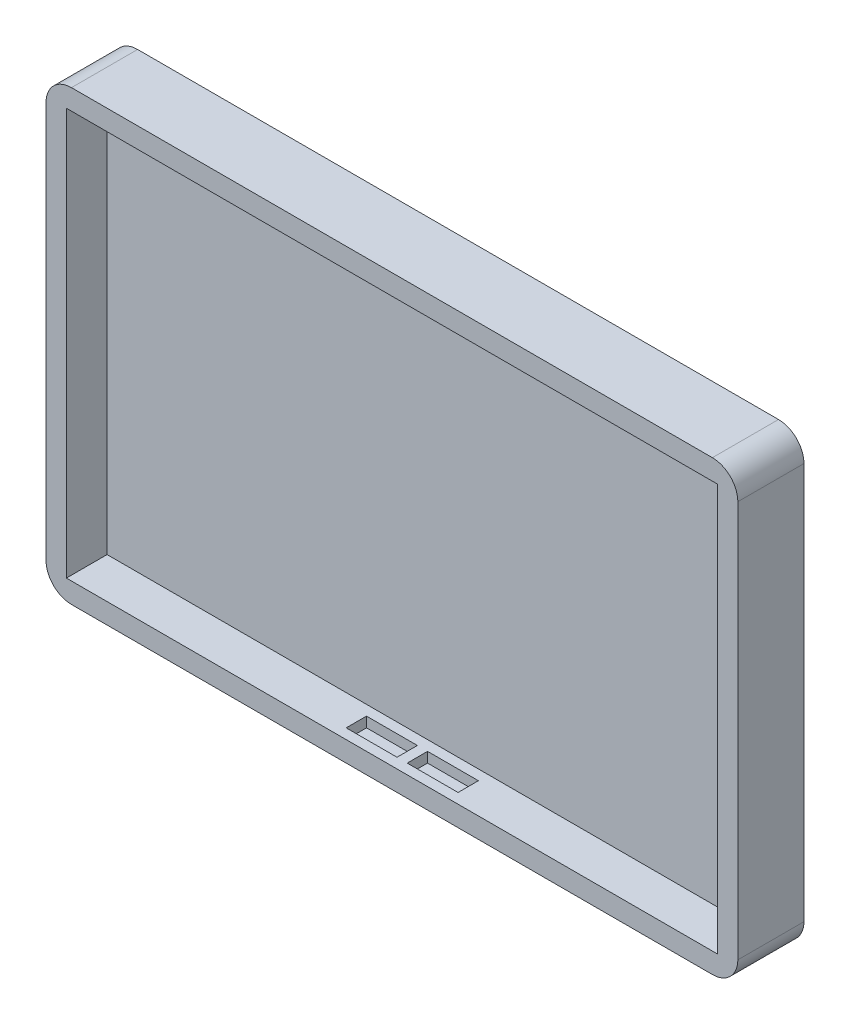
ISO-10303-21;
HEADER;
FILE_DESCRIPTION(('STEP AP214'),'2;1');
FILE_NAME('part.step','',(''),(''),'','','');
FILE_SCHEMA(('AUTOMOTIVE_DESIGN { 1 0 10303 214 1 1 1 1 }'));
ENDSEC;
DATA;
#1=APPLICATION_CONTEXT('core data for automotive mechanical design processes');
#2=APPLICATION_PROTOCOL_DEFINITION('international standard','automotive_design',2000,#1);
#3=PRODUCT_CONTEXT('',#1,'mechanical');
#4=PRODUCT('Part','Part','',(#3));
#5=PRODUCT_RELATED_PRODUCT_CATEGORY('part','',(#4));
#6=PRODUCT_DEFINITION_FORMATION('','',#4);
#7=PRODUCT_DEFINITION_CONTEXT('part definition',#1,'design');
#8=PRODUCT_DEFINITION('design','',#6,#7);
#9=PRODUCT_DEFINITION_SHAPE('','',#8);
#10=(LENGTH_UNIT() NAMED_UNIT(*) SI_UNIT(.MILLI.,.METRE.));
#11=(NAMED_UNIT(*) PLANE_ANGLE_UNIT() SI_UNIT($,.RADIAN.));
#12=(NAMED_UNIT(*) SI_UNIT($,.STERADIAN.) SOLID_ANGLE_UNIT());
#13=UNCERTAINTY_MEASURE_WITH_UNIT(LENGTH_MEASURE(1.E-05),#10,'distance_accuracy_value','');
#14=(GEOMETRIC_REPRESENTATION_CONTEXT(3) GLOBAL_UNCERTAINTY_ASSIGNED_CONTEXT((#13)) GLOBAL_UNIT_ASSIGNED_CONTEXT((#10,
#11,#12)) REPRESENTATION_CONTEXT('',''));
#15=CARTESIAN_POINT('',(0.,0.,0.));
#16=DIRECTION('',(0.,0.,1.));
#17=DIRECTION('',(1.,0.,0.));
#18=AXIS2_PLACEMENT_3D('',#15,#16,#17);
#19=CARTESIAN_POINT('',(66.,2.,2.5));
#20=DIRECTION('',(0.,-1.,0.));
#21=DIRECTION('',(1.,0.,0.));
#22=AXIS2_PLACEMENT_3D('',#19,#20,#21);
#23=PLANE('',#22);
#24=DIRECTION('',(1.,0.,0.));
#25=VECTOR('',#24,1.);
#26=CARTESIAN_POINT('',(66.,2.,5.5));
#27=LINE('',#26,#25);
#28=CARTESIAN_POINT('',(34.5,2.,5.5));
#29=VERTEX_POINT('',#28);
#30=CARTESIAN_POINT('',(39.5,2.,5.5));
#31=VERTEX_POINT('',#30);
#32=EDGE_CURVE('E350',#29,#31,#27,.T.);
#33=ORIENTED_EDGE('',*,*,#32,.F.);
#34=DIRECTION('',(0.,0.,1.));
#35=VECTOR('',#34,1.);
#36=CARTESIAN_POINT('',(34.5,2.,2.5));
#37=LINE('',#36,#35);
#38=CARTESIAN_POINT('',(34.5,2.,3.5));
#39=VERTEX_POINT('',#38);
#40=EDGE_CURVE('E347',#39,#29,#37,.T.);
#41=ORIENTED_EDGE('',*,*,#40,.F.);
#42=DIRECTION('',(-1.,0.,0.));
#43=VECTOR('',#42,1.);
#44=CARTESIAN_POINT('',(66.,2.,3.5));
#45=LINE('',#44,#43);
#46=CARTESIAN_POINT('',(39.5,2.,3.5));
#47=VERTEX_POINT('',#46);
#48=EDGE_CURVE('E344',#47,#39,#45,.T.);
#49=ORIENTED_EDGE('',*,*,#48,.F.);
#50=DIRECTION('',(0.,0.,-1.));
#51=VECTOR('',#50,1.);
#52=CARTESIAN_POINT('',(39.5,2.,2.5));
#53=LINE('',#52,#51);
#54=EDGE_CURVE('E298',#31,#47,#53,.T.);
#55=ORIENTED_EDGE('',*,*,#54,.F.);
#56=EDGE_LOOP('',(#33,#41,#49,#55));
#57=FACE_BOUND('',#56,.T.);
#58=DIRECTION('',(1.,0.,0.));
#59=VECTOR('',#58,1.);
#60=CARTESIAN_POINT('',(66.,2.,6.5));
#61=LINE('',#60,#59);
#62=CARTESIAN_POINT('',(2.,1.99999999999999,6.5));
#63=VERTEX_POINT('',#62);
#64=CARTESIAN_POINT('',(66.,2.,6.5));
#65=VERTEX_POINT('',#64);
#66=EDGE_CURVE('E373',#63,#65,#61,.T.);
#67=ORIENTED_EDGE('',*,*,#66,.T.);
#68=DIRECTION('',(0.,0.,1.));
#69=VECTOR('',#68,1.);
#70=CARTESIAN_POINT('',(66.,2.,2.5));
#71=LINE('',#70,#69);
#72=CARTESIAN_POINT('',(66.,2.,2.5));
#73=VERTEX_POINT('',#72);
#74=EDGE_CURVE('E399',#73,#65,#71,.T.);
#75=ORIENTED_EDGE('',*,*,#74,.F.);
#76=DIRECTION('',(1.,0.,0.));
#77=VECTOR('',#76,1.);
#78=CARTESIAN_POINT('',(66.,2.,2.5));
#79=LINE('',#78,#77);
#80=CARTESIAN_POINT('',(2.,1.99999999999999,2.5));
#81=VERTEX_POINT('',#80);
#82=EDGE_CURVE('E381',#81,#73,#79,.T.);
#83=ORIENTED_EDGE('',*,*,#82,.F.);
#84=DIRECTION('',(0.,0.,1.));
#85=VECTOR('',#84,1.);
#86=CARTESIAN_POINT('',(2.,1.99999999999999,2.5));
#87=LINE('',#86,#85);
#88=EDGE_CURVE('E403',#81,#63,#87,.T.);
#89=ORIENTED_EDGE('',*,*,#88,.T.);
#90=EDGE_LOOP('',(#67,#75,#83,#89));
#91=FACE_BOUND('',#90,.T.);
#92=DIRECTION('',(0.,0.,-1.));
#93=VECTOR('',#92,1.);
#94=CARTESIAN_POINT('',(33.5,2.,2.5));
#95=LINE('',#94,#93);
#96=CARTESIAN_POINT('',(33.5,2.,5.5));
#97=VERTEX_POINT('',#96);
#98=CARTESIAN_POINT('',(33.5,2.,3.5));
#99=VERTEX_POINT('',#98);
#100=EDGE_CURVE('E363',#97,#99,#95,.T.);
#101=ORIENTED_EDGE('',*,*,#100,.F.);
#102=DIRECTION('',(1.,0.,0.));
#103=VECTOR('',#102,1.);
#104=CARTESIAN_POINT('',(66.,2.,5.5));
#105=LINE('',#104,#103);
#106=CARTESIAN_POINT('',(28.5,2.,5.5));
#107=VERTEX_POINT('',#106);
#108=EDGE_CURVE('E360',#107,#97,#105,.T.);
#109=ORIENTED_EDGE('',*,*,#108,.F.);
#110=DIRECTION('',(0.,0.,1.));
#111=VECTOR('',#110,1.);
#112=CARTESIAN_POINT('',(28.5,2.,2.5));
#113=LINE('',#112,#111);
#114=CARTESIAN_POINT('',(28.5,2.,3.5));
#115=VERTEX_POINT('',#114);
#116=EDGE_CURVE('E357',#115,#107,#113,.T.);
#117=ORIENTED_EDGE('',*,*,#116,.F.);
#118=DIRECTION('',(-1.,0.,0.));
#119=VECTOR('',#118,1.);
#120=CARTESIAN_POINT('',(66.,2.,3.50000000000001));
#121=LINE('',#120,#119);
#122=EDGE_CURVE('E354',#99,#115,#121,.T.);
#123=ORIENTED_EDGE('',*,*,#122,.F.);
#124=EDGE_LOOP('',(#101,#109,#117,#123));
#125=FACE_BOUND('',#124,.T.);
#126=ADVANCED_FACE('F43',(#57,#91,#125),#23,.F.);
#127=CARTESIAN_POINT('',(66.,42.,2.5));
#128=DIRECTION('',(0.,1.,0.));
#129=DIRECTION('',(-1.,0.,0.));
#130=AXIS2_PLACEMENT_3D('',#127,#128,#129);
#131=PLANE('',#130);
#132=DIRECTION('',(-1.,0.,0.));
#133=VECTOR('',#132,1.);
#134=CARTESIAN_POINT('',(66.,42.,5.5));
#135=LINE('',#134,#133);
#136=CARTESIAN_POINT('',(39.5,42.,5.5));
#137=VERTEX_POINT('',#136);
#138=CARTESIAN_POINT('',(34.5,42.,5.5));
#139=VERTEX_POINT('',#138);
#140=EDGE_CURVE('E450',#137,#139,#135,.T.);
#141=ORIENTED_EDGE('',*,*,#140,.F.);
#142=DIRECTION('',(0.,0.,1.));
#143=VECTOR('',#142,1.);
#144=CARTESIAN_POINT('',(39.5,42.,2.5));
#145=LINE('',#144,#143);
#146=CARTESIAN_POINT('',(39.5,42.,3.5));
#147=VERTEX_POINT('',#146);
#148=EDGE_CURVE('E427',#147,#137,#145,.T.);
#149=ORIENTED_EDGE('',*,*,#148,.F.);
#150=DIRECTION('',(1.,0.,0.));
#151=VECTOR('',#150,1.);
#152=CARTESIAN_POINT('',(66.,42.,3.5));
#153=LINE('',#152,#151);
#154=CARTESIAN_POINT('',(34.5,42.,3.5));
#155=VERTEX_POINT('',#154);
#156=EDGE_CURVE('E443',#155,#147,#153,.T.);
#157=ORIENTED_EDGE('',*,*,#156,.F.);
#158=DIRECTION('',(0.,0.,-1.));
#159=VECTOR('',#158,1.);
#160=CARTESIAN_POINT('',(34.5,42.,2.5));
#161=LINE('',#160,#159);
#162=EDGE_CURVE('E447',#139,#155,#161,.T.);
#163=ORIENTED_EDGE('',*,*,#162,.F.);
#164=EDGE_LOOP('',(#141,#149,#157,#163));
#165=FACE_BOUND('',#164,.T.);
#166=DIRECTION('',(-1.,0.,0.));
#167=VECTOR('',#166,1.);
#168=CARTESIAN_POINT('',(66.,42.,6.5));
#169=LINE('',#168,#167);
#170=CARTESIAN_POINT('',(66.,42.,6.5));
#171=VERTEX_POINT('',#170);
#172=CARTESIAN_POINT('',(2.,42.,6.5));
#173=VERTEX_POINT('',#172);
#174=EDGE_CURVE('E388',#171,#173,#169,.T.);
#175=ORIENTED_EDGE('',*,*,#174,.T.);
#176=DIRECTION('',(0.,0.,1.));
#177=VECTOR('',#176,1.);
#178=CARTESIAN_POINT('',(2.,42.,2.5));
#179=LINE('',#178,#177);
#180=CARTESIAN_POINT('',(2.,42.,2.5));
#181=VERTEX_POINT('',#180);
#182=EDGE_CURVE('E406',#181,#173,#179,.T.);
#183=ORIENTED_EDGE('',*,*,#182,.F.);
#184=DIRECTION('',(-1.,0.,0.));
#185=VECTOR('',#184,1.);
#186=CARTESIAN_POINT('',(66.,42.,2.5));
#187=LINE('',#186,#185);
#188=CARTESIAN_POINT('',(66.,42.,2.5));
#189=VERTEX_POINT('',#188);
#190=EDGE_CURVE('E372',#189,#181,#187,.T.);
#191=ORIENTED_EDGE('',*,*,#190,.F.);
#192=DIRECTION('',(0.,0.,1.));
#193=VECTOR('',#192,1.);
#194=CARTESIAN_POINT('',(66.,42.,2.5));
#195=LINE('',#194,#193);
#196=EDGE_CURVE('E385',#189,#171,#195,.T.);
#197=ORIENTED_EDGE('',*,*,#196,.T.);
#198=EDGE_LOOP('',(#175,#183,#191,#197));
#199=FACE_BOUND('',#198,.T.);
#200=DIRECTION('',(0.,0.,1.));
#201=VECTOR('',#200,1.);
#202=CARTESIAN_POINT('',(33.5,42.,2.5));
#203=LINE('',#202,#201);
#204=CARTESIAN_POINT('',(33.5,42.,3.5));
#205=VERTEX_POINT('',#204);
#206=CARTESIAN_POINT('',(33.5,42.,5.5));
#207=VERTEX_POINT('',#206);
#208=EDGE_CURVE('E238',#205,#207,#203,.T.);
#209=ORIENTED_EDGE('',*,*,#208,.F.);
#210=DIRECTION('',(1.,0.,0.));
#211=VECTOR('',#210,1.);
#212=CARTESIAN_POINT('',(66.,42.,3.50000000000001));
#213=LINE('',#212,#211);
#214=CARTESIAN_POINT('',(28.5,42.,3.5));
#215=VERTEX_POINT('',#214);
#216=EDGE_CURVE('E453',#215,#205,#213,.T.);
#217=ORIENTED_EDGE('',*,*,#216,.F.);
#218=DIRECTION('',(0.,0.,-1.));
#219=VECTOR('',#218,1.);
#220=CARTESIAN_POINT('',(28.5,42.,2.5));
#221=LINE('',#220,#219);
#222=CARTESIAN_POINT('',(28.5,42.,5.5));
#223=VERTEX_POINT('',#222);
#224=EDGE_CURVE('E456',#223,#215,#221,.T.);
#225=ORIENTED_EDGE('',*,*,#224,.F.);
#226=DIRECTION('',(-1.,0.,0.));
#227=VECTOR('',#226,1.);
#228=CARTESIAN_POINT('',(66.,42.,5.5));
#229=LINE('',#228,#227);
#230=EDGE_CURVE('E460',#207,#223,#229,.T.);
#231=ORIENTED_EDGE('',*,*,#230,.F.);
#232=EDGE_LOOP('',(#209,#217,#225,#231));
#233=FACE_BOUND('',#232,.T.);
#234=ADVANCED_FACE('F516',(#165,#199,#233),#131,.F.);
#235=CARTESIAN_POINT('',(0.,0.,6.5));
#236=DIRECTION('',(1.,0.,0.));
#237=DIRECTION('',(0.,0.,-1.));
#238=AXIS2_PLACEMENT_3D('',#235,#236,#237);
#239=PLANE('',#238);
#240=DIRECTION('',(0.,-1.,0.));
#241=VECTOR('',#240,1.);
#242=CARTESIAN_POINT('',(0.,0.,6.5));
#243=LINE('',#242,#241);
#244=CARTESIAN_POINT('',(0.,41.5,6.5));
#245=VERTEX_POINT('',#244);
#246=CARTESIAN_POINT('',(0.,2.5,6.5));
#247=VERTEX_POINT('',#246);
#248=EDGE_CURVE('E412',#245,#247,#243,.T.);
#249=ORIENTED_EDGE('',*,*,#248,.F.);
#250=DIRECTION('',(0.,0.,-1.));
#251=VECTOR('',#250,1.);
#252=CARTESIAN_POINT('',(0.,41.5,6.5));
#253=LINE('',#252,#251);
#254=CARTESIAN_POINT('',(0.,41.5,0.));
#255=VERTEX_POINT('',#254);
#256=EDGE_CURVE('E468',#245,#255,#253,.T.);
#257=ORIENTED_EDGE('',*,*,#256,.T.);
#258=DIRECTION('',(0.,-1.,0.));
#259=VECTOR('',#258,1.);
#260=CARTESIAN_POINT('',(0.,0.,0.));
#261=LINE('',#260,#259);
#262=CARTESIAN_POINT('',(0.,2.5,0.));
#263=VERTEX_POINT('',#262);
#264=EDGE_CURVE('E402',#255,#263,#261,.T.);
#265=ORIENTED_EDGE('',*,*,#264,.T.);
#266=DIRECTION('',(0.,0.,-1.));
#267=VECTOR('',#266,1.);
#268=CARTESIAN_POINT('',(0.,2.5,6.5));
#269=LINE('',#268,#267);
#270=EDGE_CURVE('E465',#263,#247,#269,.F.);
#271=ORIENTED_EDGE('',*,*,#270,.T.);
#272=EDGE_LOOP('',(#249,#257,#265,#271));
#273=FACE_BOUND('',#272,.T.);
#274=ADVANCED_FACE('F539',(#273),#239,.F.);
#275=CARTESIAN_POINT('',(0.,0.,6.5));
#276=DIRECTION('',(0.,1.,0.));
#277=DIRECTION('',(0.,0.,1.));
#278=AXIS2_PLACEMENT_3D('',#275,#276,#277);
#279=PLANE('',#278);
#280=DIRECTION('',(1.,0.,0.));
#281=VECTOR('',#280,1.);
#282=CARTESIAN_POINT('',(0.,0.,6.5));
#283=LINE('',#282,#281);
#284=CARTESIAN_POINT('',(2.5,0.,6.5));
#285=VERTEX_POINT('',#284);
#286=CARTESIAN_POINT('',(65.5,0.,6.5));
#287=VERTEX_POINT('',#286);
#288=EDGE_CURVE('E416',#285,#287,#283,.T.);
#289=ORIENTED_EDGE('',*,*,#288,.F.);
#290=DIRECTION('',(0.,0.,-1.));
#291=VECTOR('',#290,1.);
#292=CARTESIAN_POINT('',(2.5,0.,6.5));
#293=LINE('',#292,#291);
#294=CARTESIAN_POINT('',(2.5,0.,0.));
#295=VERTEX_POINT('',#294);
#296=EDGE_CURVE('E505',#285,#295,#293,.T.);
#297=ORIENTED_EDGE('',*,*,#296,.T.);
#298=DIRECTION('',(1.,0.,0.));
#299=VECTOR('',#298,1.);
#300=CARTESIAN_POINT('',(0.,0.,0.));
#301=LINE('',#300,#299);
#302=CARTESIAN_POINT('',(65.5,0.,0.));
#303=VERTEX_POINT('',#302);
#304=EDGE_CURVE('E431',#295,#303,#301,.T.);
#305=ORIENTED_EDGE('',*,*,#304,.T.);
#306=DIRECTION('',(0.,0.,-1.));
#307=VECTOR('',#306,1.);
#308=CARTESIAN_POINT('',(65.5,0.,6.5));
#309=LINE('',#308,#307);
#310=EDGE_CURVE('E502',#303,#287,#309,.F.);
#311=ORIENTED_EDGE('',*,*,#310,.T.);
#312=EDGE_LOOP('',(#289,#297,#305,#311));
#313=FACE_BOUND('',#312,.T.);
#314=ADVANCED_FACE('F571',(#313),#279,.F.);
#315=CARTESIAN_POINT('',(68.,0.,6.5));
#316=DIRECTION('',(-1.,0.,0.));
#317=DIRECTION('',(0.,0.,1.));
#318=AXIS2_PLACEMENT_3D('',#315,#316,#317);
#319=PLANE('',#318);
#320=DIRECTION('',(0.,1.,0.));
#321=VECTOR('',#320,1.);
#322=CARTESIAN_POINT('',(68.,0.,6.5));
#323=LINE('',#322,#321);
#324=CARTESIAN_POINT('',(68.,2.5,6.5));
#325=VERTEX_POINT('',#324);
#326=CARTESIAN_POINT('',(68.,41.5,6.5));
#327=VERTEX_POINT('',#326);
#328=EDGE_CURVE('E420',#325,#327,#323,.T.);
#329=ORIENTED_EDGE('',*,*,#328,.F.);
#330=DIRECTION('',(0.,0.,-1.));
#331=VECTOR('',#330,1.);
#332=CARTESIAN_POINT('',(68.,2.5,6.5));
#333=LINE('',#332,#331);
#334=CARTESIAN_POINT('',(68.,2.5,0.));
#335=VERTEX_POINT('',#334);
#336=EDGE_CURVE('E11',#325,#335,#333,.T.);
#337=ORIENTED_EDGE('',*,*,#336,.T.);
#338=DIRECTION('',(0.,1.,0.));
#339=VECTOR('',#338,1.);
#340=CARTESIAN_POINT('',(68.,0.,0.));
#341=LINE('',#340,#339);
#342=CARTESIAN_POINT('',(68.,41.5,0.));
#343=VERTEX_POINT('',#342);
#344=EDGE_CURVE('E435',#335,#343,#341,.T.);
#345=ORIENTED_EDGE('',*,*,#344,.T.);
#346=DIRECTION('',(0.,0.,-1.));
#347=VECTOR('',#346,1.);
#348=CARTESIAN_POINT('',(68.,41.5,6.5));
#349=LINE('',#348,#347);
#350=EDGE_CURVE('E52',#343,#327,#349,.F.);
#351=ORIENTED_EDGE('',*,*,#350,.T.);
#352=EDGE_LOOP('',(#329,#337,#345,#351));
#353=FACE_BOUND('',#352,.T.);
#354=ADVANCED_FACE('F567',(#353),#319,.F.);
#355=CARTESIAN_POINT('',(0.,44.,6.5));
#356=DIRECTION('',(0.,-1.,0.));
#357=DIRECTION('',(0.,0.,-1.));
#358=AXIS2_PLACEMENT_3D('',#355,#356,#357);
#359=PLANE('',#358);
#360=DIRECTION('',(-1.,0.,0.));
#361=VECTOR('',#360,1.);
#362=CARTESIAN_POINT('',(0.,44.,0.));
#363=LINE('',#362,#361);
#364=CARTESIAN_POINT('',(65.5,44.,0.));
#365=VERTEX_POINT('',#364);
#366=CARTESIAN_POINT('',(2.5,44.,0.));
#367=VERTEX_POINT('',#366);
#368=EDGE_CURVE('E417',#365,#367,#363,.T.);
#369=ORIENTED_EDGE('',*,*,#368,.T.);
#370=DIRECTION('',(0.,0.,-1.));
#371=VECTOR('',#370,1.);
#372=CARTESIAN_POINT('',(2.5,44.,6.5));
#373=LINE('',#372,#371);
#374=CARTESIAN_POINT('',(2.5,44.,6.5));
#375=VERTEX_POINT('',#374);
#376=EDGE_CURVE('E488',#367,#375,#373,.F.);
#377=ORIENTED_EDGE('',*,*,#376,.T.);
#378=DIRECTION('',(-1.,0.,0.));
#379=VECTOR('',#378,1.);
#380=CARTESIAN_POINT('',(0.,44.,6.5));
#381=LINE('',#380,#379);
#382=CARTESIAN_POINT('',(65.5,44.,6.5));
#383=VERTEX_POINT('',#382);
#384=EDGE_CURVE('E423',#383,#375,#381,.T.);
#385=ORIENTED_EDGE('',*,*,#384,.F.);
#386=DIRECTION('',(0.,0.,-1.));
#387=VECTOR('',#386,1.);
#388=CARTESIAN_POINT('',(65.5,44.,6.5));
#389=LINE('',#388,#387);
#390=EDGE_CURVE('E484',#383,#365,#389,.T.);
#391=ORIENTED_EDGE('',*,*,#390,.T.);
#392=EDGE_LOOP('',(#369,#377,#385,#391));
#393=FACE_BOUND('',#392,.T.);
#394=ADVANCED_FACE('F560',(#393),#359,.F.);
#395=CARTESIAN_POINT('',(0.,0.,6.5));
#396=DIRECTION('',(0.,0.,-1.));
#397=DIRECTION('',(-1.,0.,0.));
#398=AXIS2_PLACEMENT_3D('',#395,#396,#397);
#399=PLANE('',#398);
#400=ORIENTED_EDGE('',*,*,#174,.F.);
#401=DIRECTION('',(0.,1.,0.));
#402=VECTOR('',#401,1.);
#403=CARTESIAN_POINT('',(66.,42.,6.5));
#404=LINE('',#403,#402);
#405=EDGE_CURVE('E367',#65,#171,#404,.T.);
#406=ORIENTED_EDGE('',*,*,#405,.F.);
#407=ORIENTED_EDGE('',*,*,#66,.F.);
#408=DIRECTION('',(0.,-1.,0.));
#409=VECTOR('',#408,1.);
#410=CARTESIAN_POINT('',(2.,42.,6.5));
#411=LINE('',#410,#409);
#412=EDGE_CURVE('E392',#173,#63,#411,.T.);
#413=ORIENTED_EDGE('',*,*,#412,.F.);
#414=EDGE_LOOP('',(#400,#406,#407,#413));
#415=FACE_BOUND('',#414,.T.);
#416=ORIENTED_EDGE('',*,*,#384,.T.);
#417=CARTESIAN_POINT('',(2.5,41.5,6.5));
#418=DIRECTION('',(0.,0.,-1.));
#419=DIRECTION('',(-1.,0.,0.));
#420=AXIS2_PLACEMENT_3D('',#417,#418,#419);
#421=CIRCLE('',#420,2.5);
#422=EDGE_CURVE('E499',#375,#245,#421,.F.);
#423=ORIENTED_EDGE('',*,*,#422,.T.);
#424=ORIENTED_EDGE('',*,*,#248,.T.);
#425=CARTESIAN_POINT('',(2.5,2.5,6.5));
#426=DIRECTION('',(0.,0.,-1.));
#427=DIRECTION('',(-1.,0.,0.));
#428=AXIS2_PLACEMENT_3D('',#425,#426,#427);
#429=CIRCLE('',#428,2.5);
#430=EDGE_CURVE('E496',#247,#285,#429,.F.);
#431=ORIENTED_EDGE('',*,*,#430,.T.);
#432=ORIENTED_EDGE('',*,*,#288,.T.);
#433=CARTESIAN_POINT('',(65.5,2.5,6.5));
#434=DIRECTION('',(0.,0.,-1.));
#435=DIRECTION('',(-1.,0.,0.));
#436=AXIS2_PLACEMENT_3D('',#433,#434,#435);
#437=CIRCLE('',#436,2.5);
#438=EDGE_CURVE('E65',#287,#325,#437,.F.);
#439=ORIENTED_EDGE('',*,*,#438,.T.);
#440=ORIENTED_EDGE('',*,*,#328,.T.);
#441=CARTESIAN_POINT('',(65.5,41.5,6.5));
#442=DIRECTION('',(0.,0.,-1.));
#443=DIRECTION('',(-1.,0.,0.));
#444=AXIS2_PLACEMENT_3D('',#441,#442,#443);
#445=CIRCLE('',#444,2.5);
#446=EDGE_CURVE('E491',#327,#383,#445,.F.);
#447=ORIENTED_EDGE('',*,*,#446,.T.);
#448=EDGE_LOOP('',(#416,#423,#424,#431,#432,#439,#440,#447));
#449=FACE_BOUND('',#448,.T.);
#450=ADVANCED_FACE('F557',(#415,#449),#399,.F.);
#451=CARTESIAN_POINT('',(0.,0.,0.));
#452=DIRECTION('',(0.,0.,-1.));
#453=DIRECTION('',(-1.,0.,0.));
#454=AXIS2_PLACEMENT_3D('',#451,#452,#453);
#455=PLANE('',#454);
#456=ORIENTED_EDGE('',*,*,#264,.F.);
#457=CARTESIAN_POINT('',(2.5,41.5,0.));
#458=DIRECTION('',(0.,0.,-1.));
#459=DIRECTION('',(-1.,0.,0.));
#460=AXIS2_PLACEMENT_3D('',#457,#458,#459);
#461=CIRCLE('',#460,2.5);
#462=EDGE_CURVE('E481',#255,#367,#461,.T.);
#463=ORIENTED_EDGE('',*,*,#462,.T.);
#464=ORIENTED_EDGE('',*,*,#368,.F.);
#465=CARTESIAN_POINT('',(65.5,41.5,0.));
#466=DIRECTION('',(0.,0.,-1.));
#467=DIRECTION('',(-1.,0.,0.));
#468=AXIS2_PLACEMENT_3D('',#465,#466,#467);
#469=CIRCLE('',#468,2.5);
#470=EDGE_CURVE('E472',#365,#343,#469,.T.);
#471=ORIENTED_EDGE('',*,*,#470,.T.);
#472=ORIENTED_EDGE('',*,*,#344,.F.);
#473=CARTESIAN_POINT('',(65.5,2.5,0.));
#474=DIRECTION('',(0.,0.,-1.));
#475=DIRECTION('',(-1.,0.,0.));
#476=AXIS2_PLACEMENT_3D('',#473,#474,#475);
#477=CIRCLE('',#476,2.5);
#478=EDGE_CURVE('E475',#335,#303,#477,.T.);
#479=ORIENTED_EDGE('',*,*,#478,.T.);
#480=ORIENTED_EDGE('',*,*,#304,.F.);
#481=CARTESIAN_POINT('',(2.5,2.5,0.));
#482=DIRECTION('',(0.,0.,-1.));
#483=DIRECTION('',(-1.,0.,0.));
#484=AXIS2_PLACEMENT_3D('',#481,#482,#483);
#485=CIRCLE('',#484,2.5);
#486=EDGE_CURVE('E478',#295,#263,#485,.T.);
#487=ORIENTED_EDGE('',*,*,#486,.T.);
#488=EDGE_LOOP('',(#456,#463,#464,#471,#472,#479,#480,#487));
#489=FACE_BOUND('',#488,.T.);
#490=ADVANCED_FACE('F555',(#489),#455,.T.);
#491=CARTESIAN_POINT('',(66.,42.,2.5));
#492=DIRECTION('',(1.,0.,0.));
#493=DIRECTION('',(0.,0.,-1.));
#494=AXIS2_PLACEMENT_3D('',#491,#492,#493);
#495=PLANE('',#494);
#496=ORIENTED_EDGE('',*,*,#405,.T.);
#497=ORIENTED_EDGE('',*,*,#196,.F.);
#498=DIRECTION('',(0.,1.,0.));
#499=VECTOR('',#498,1.);
#500=CARTESIAN_POINT('',(66.,42.,2.5));
#501=LINE('',#500,#499);
#502=EDGE_CURVE('E368',#73,#189,#501,.T.);
#503=ORIENTED_EDGE('',*,*,#502,.F.);
#504=ORIENTED_EDGE('',*,*,#74,.T.);
#505=EDGE_LOOP('',(#496,#497,#503,#504));
#506=FACE_BOUND('',#505,.T.);
#507=ADVANCED_FACE('F550',(#506),#495,.F.);
#508=CARTESIAN_POINT('',(2.,42.,2.5));
#509=DIRECTION('',(-1.,0.,0.));
#510=DIRECTION('',(0.,0.,1.));
#511=AXIS2_PLACEMENT_3D('',#508,#509,#510);
#512=PLANE('',#511);
#513=ORIENTED_EDGE('',*,*,#412,.T.);
#514=ORIENTED_EDGE('',*,*,#88,.F.);
#515=DIRECTION('',(0.,-1.,0.));
#516=VECTOR('',#515,1.);
#517=CARTESIAN_POINT('',(2.,42.,2.5));
#518=LINE('',#517,#516);
#519=EDGE_CURVE('E377',#181,#81,#518,.T.);
#520=ORIENTED_EDGE('',*,*,#519,.F.);
#521=ORIENTED_EDGE('',*,*,#182,.T.);
#522=EDGE_LOOP('',(#513,#514,#520,#521));
#523=FACE_BOUND('',#522,.T.);
#524=ADVANCED_FACE('F548',(#523),#512,.F.);
#525=CARTESIAN_POINT('',(0.,0.,2.5));
#526=DIRECTION('',(0.,0.,-1.));
#527=DIRECTION('',(-1.,0.,0.));
#528=AXIS2_PLACEMENT_3D('',#525,#526,#527);
#529=PLANE('',#528);
#530=ORIENTED_EDGE('',*,*,#502,.T.);
#531=ORIENTED_EDGE('',*,*,#190,.T.);
#532=ORIENTED_EDGE('',*,*,#519,.T.);
#533=ORIENTED_EDGE('',*,*,#82,.T.);
#534=EDGE_LOOP('',(#530,#531,#532,#533));
#535=FACE_BOUND('',#534,.T.);
#536=ADVANCED_FACE('F546',(#535),#529,.F.);
#537=CARTESIAN_POINT('',(0.,43.,0.));
#538=DIRECTION('',(0.,-1.,0.));
#539=DIRECTION('',(0.,0.,-1.));
#540=AXIS2_PLACEMENT_3D('',#537,#538,#539);
#541=PLANE('',#540);
#542=DIRECTION('',(-1.,0.,0.));
#543=VECTOR('',#542,1.);
#544=CARTESIAN_POINT('',(39.5,43.,5.5));
#545=LINE('',#544,#543);
#546=CARTESIAN_POINT('',(39.5,43.,5.5));
#547=VERTEX_POINT('',#546);
#548=CARTESIAN_POINT('',(34.5,43.,5.5));
#549=VERTEX_POINT('',#548);
#550=EDGE_CURVE('E260',#547,#549,#545,.T.);
#551=ORIENTED_EDGE('',*,*,#550,.T.);
#552=DIRECTION('',(0.,0.,-1.));
#553=VECTOR('',#552,1.);
#554=CARTESIAN_POINT('',(34.5,43.,5.5));
#555=LINE('',#554,#553);
#556=CARTESIAN_POINT('',(34.5,43.,3.5));
#557=VERTEX_POINT('',#556);
#558=EDGE_CURVE('E264',#549,#557,#555,.T.);
#559=ORIENTED_EDGE('',*,*,#558,.T.);
#560=DIRECTION('',(1.,0.,0.));
#561=VECTOR('',#560,1.);
#562=CARTESIAN_POINT('',(39.5,43.,3.5));
#563=LINE('',#562,#561);
#564=CARTESIAN_POINT('',(39.5,43.,3.5));
#565=VERTEX_POINT('',#564);
#566=EDGE_CURVE('E335',#557,#565,#563,.T.);
#567=ORIENTED_EDGE('',*,*,#566,.T.);
#568=DIRECTION('',(0.,0.,1.));
#569=VECTOR('',#568,1.);
#570=CARTESIAN_POINT('',(39.5,43.,5.5));
#571=LINE('',#570,#569);
#572=EDGE_CURVE('E331',#565,#547,#571,.T.);
#573=ORIENTED_EDGE('',*,*,#572,.T.);
#574=EDGE_LOOP('',(#551,#559,#567,#573));
#575=FACE_BOUND('',#574,.T.);
#576=ADVANCED_FACE('F852',(#575),#541,.T.);
#577=CARTESIAN_POINT('',(39.5,0.999999999999973,5.5));
#578=DIRECTION('',(-1.,0.,0.));
#579=DIRECTION('',(0.,-1.,0.));
#580=AXIS2_PLACEMENT_3D('',#577,#578,#579);
#581=PLANE('',#580);
#582=ORIENTED_EDGE('',*,*,#148,.T.);
#583=DIRECTION('',(0.,1.,0.));
#584=VECTOR('',#583,1.);
#585=CARTESIAN_POINT('',(39.5,0.999999999999973,5.5));
#586=LINE('',#585,#584);
#587=EDGE_CURVE('E314',#137,#547,#586,.T.);
#588=ORIENTED_EDGE('',*,*,#587,.T.);
#589=ORIENTED_EDGE('',*,*,#572,.F.);
#590=DIRECTION('',(0.,1.,0.));
#591=VECTOR('',#590,1.);
#592=CARTESIAN_POINT('',(39.5,0.999999999999973,3.5));
#593=LINE('',#592,#591);
#594=EDGE_CURVE('E309',#147,#565,#593,.T.);
#595=ORIENTED_EDGE('',*,*,#594,.F.);
#596=EDGE_LOOP('',(#582,#588,#589,#595));
#597=FACE_BOUND('',#596,.T.);
#598=ADVANCED_FACE('F745',(#597),#581,.T.);
#599=CARTESIAN_POINT('',(39.5,0.999999999999973,3.5));
#600=DIRECTION('',(0.,0.,1.));
#601=DIRECTION('',(1.,0.,0.));
#602=AXIS2_PLACEMENT_3D('',#599,#600,#601);
#603=PLANE('',#602);
#604=ORIENTED_EDGE('',*,*,#156,.T.);
#605=ORIENTED_EDGE('',*,*,#594,.T.);
#606=ORIENTED_EDGE('',*,*,#566,.F.);
#607=DIRECTION('',(0.,1.,0.));
#608=VECTOR('',#607,1.);
#609=CARTESIAN_POINT('',(34.5,0.999999999999973,3.5));
#610=LINE('',#609,#608);
#611=EDGE_CURVE('E303',#155,#557,#610,.T.);
#612=ORIENTED_EDGE('',*,*,#611,.F.);
#613=EDGE_LOOP('',(#604,#605,#606,#612));
#614=FACE_BOUND('',#613,.T.);
#615=ADVANCED_FACE('F757',(#614),#603,.T.);
#616=CARTESIAN_POINT('',(34.5,0.999999999999973,5.5));
#617=DIRECTION('',(1.,0.,0.));
#618=DIRECTION('',(0.,1.,0.));
#619=AXIS2_PLACEMENT_3D('',#616,#617,#618);
#620=PLANE('',#619);
#621=ORIENTED_EDGE('',*,*,#162,.T.);
#622=ORIENTED_EDGE('',*,*,#611,.T.);
#623=ORIENTED_EDGE('',*,*,#558,.F.);
#624=DIRECTION('',(0.,1.,0.));
#625=VECTOR('',#624,1.);
#626=CARTESIAN_POINT('',(34.5,0.999999999999973,5.5));
#627=LINE('',#626,#625);
#628=EDGE_CURVE('E304',#139,#549,#627,.T.);
#629=ORIENTED_EDGE('',*,*,#628,.F.);
#630=EDGE_LOOP('',(#621,#622,#623,#629));
#631=FACE_BOUND('',#630,.T.);
#632=ADVANCED_FACE('F769',(#631),#620,.T.);
#633=CARTESIAN_POINT('',(39.5,0.999999999999973,5.5));
#634=DIRECTION('',(0.,0.,-1.));
#635=DIRECTION('',(-1.,0.,0.));
#636=AXIS2_PLACEMENT_3D('',#633,#634,#635);
#637=PLANE('',#636);
#638=ORIENTED_EDGE('',*,*,#140,.T.);
#639=ORIENTED_EDGE('',*,*,#628,.T.);
#640=ORIENTED_EDGE('',*,*,#550,.F.);
#641=ORIENTED_EDGE('',*,*,#587,.F.);
#642=EDGE_LOOP('',(#638,#639,#640,#641));
#643=FACE_BOUND('',#642,.T.);
#644=ADVANCED_FACE('F780',(#643),#637,.T.);
#645=CARTESIAN_POINT('',(0.,43.,0.));
#646=DIRECTION('',(0.,1.,0.));
#647=DIRECTION('',(-1.,0.,0.));
#648=AXIS2_PLACEMENT_3D('',#645,#646,#647);
#649=PLANE('',#648);
#650=DIRECTION('',(0.,0.,1.));
#651=VECTOR('',#650,1.);
#652=CARTESIAN_POINT('',(33.5,43.,5.5));
#653=LINE('',#652,#651);
#654=CARTESIAN_POINT('',(33.5,43.,3.5));
#655=VERTEX_POINT('',#654);
#656=CARTESIAN_POINT('',(33.5,43.,5.5));
#657=VERTEX_POINT('',#656);
#658=EDGE_CURVE('E235',#655,#657,#653,.T.);
#659=ORIENTED_EDGE('',*,*,#658,.T.);
#660=DIRECTION('',(-1.,0.,0.));
#661=VECTOR('',#660,1.);
#662=CARTESIAN_POINT('',(33.5,43.,5.5));
#663=LINE('',#662,#661);
#664=CARTESIAN_POINT('',(28.5,43.,5.5));
#665=VERTEX_POINT('',#664);
#666=EDGE_CURVE('E246',#657,#665,#663,.T.);
#667=ORIENTED_EDGE('',*,*,#666,.T.);
#668=DIRECTION('',(0.,0.,-1.));
#669=VECTOR('',#668,1.);
#670=CARTESIAN_POINT('',(28.5,43.,5.5));
#671=LINE('',#670,#669);
#672=CARTESIAN_POINT('',(28.5,43.,3.5));
#673=VERTEX_POINT('',#672);
#674=EDGE_CURVE('E254',#665,#673,#671,.T.);
#675=ORIENTED_EDGE('',*,*,#674,.T.);
#676=DIRECTION('',(1.,0.,0.));
#677=VECTOR('',#676,1.);
#678=CARTESIAN_POINT('',(33.5,43.,3.5));
#679=LINE('',#678,#677);
#680=EDGE_CURVE('E258',#673,#655,#679,.T.);
#681=ORIENTED_EDGE('',*,*,#680,.T.);
#682=EDGE_LOOP('',(#659,#667,#675,#681));
#683=FACE_BOUND('',#682,.T.);
#684=ADVANCED_FACE('F256',(#683),#649,.F.);
#685=CARTESIAN_POINT('',(33.5,0.999999999999973,3.5));
#686=DIRECTION('',(0.,0.,1.));
#687=DIRECTION('',(1.,0.,0.));
#688=AXIS2_PLACEMENT_3D('',#685,#686,#687);
#689=PLANE('',#688);
#690=ORIENTED_EDGE('',*,*,#216,.T.);
#691=DIRECTION('',(0.,1.,0.));
#692=VECTOR('',#691,1.);
#693=CARTESIAN_POINT('',(33.5,0.999999999999973,3.5));
#694=LINE('',#693,#692);
#695=EDGE_CURVE('E284',#205,#655,#694,.T.);
#696=ORIENTED_EDGE('',*,*,#695,.T.);
#697=ORIENTED_EDGE('',*,*,#680,.F.);
#698=DIRECTION('',(0.,1.,0.));
#699=VECTOR('',#698,1.);
#700=CARTESIAN_POINT('',(28.5,0.999999999999966,3.5));
#701=LINE('',#700,#699);
#702=EDGE_CURVE('E288',#215,#673,#701,.T.);
#703=ORIENTED_EDGE('',*,*,#702,.F.);
#704=EDGE_LOOP('',(#690,#696,#697,#703));
#705=FACE_BOUND('',#704,.T.);
#706=ADVANCED_FACE('F513',(#705),#689,.T.);
#707=CARTESIAN_POINT('',(28.5,0.999999999999966,5.5));
#708=DIRECTION('',(1.,0.,0.));
#709=DIRECTION('',(0.,1.,0.));
#710=AXIS2_PLACEMENT_3D('',#707,#708,#709);
#711=PLANE('',#710);
#712=ORIENTED_EDGE('',*,*,#224,.T.);
#713=ORIENTED_EDGE('',*,*,#702,.T.);
#714=ORIENTED_EDGE('',*,*,#674,.F.);
#715=DIRECTION('',(0.,1.,0.));
#716=VECTOR('',#715,1.);
#717=CARTESIAN_POINT('',(28.5,0.999999999999966,5.5));
#718=LINE('',#717,#716);
#719=EDGE_CURVE('E249',#223,#665,#718,.T.);
#720=ORIENTED_EDGE('',*,*,#719,.F.);
#721=EDGE_LOOP('',(#712,#713,#714,#720));
#722=FACE_BOUND('',#721,.T.);
#723=ADVANCED_FACE('F519',(#722),#711,.T.);
#724=CARTESIAN_POINT('',(33.5,0.999999999999973,5.5));
#725=DIRECTION('',(0.,0.,-1.));
#726=DIRECTION('',(-1.,0.,0.));
#727=AXIS2_PLACEMENT_3D('',#724,#725,#726);
#728=PLANE('',#727);
#729=ORIENTED_EDGE('',*,*,#230,.T.);
#730=ORIENTED_EDGE('',*,*,#719,.T.);
#731=ORIENTED_EDGE('',*,*,#666,.F.);
#732=DIRECTION('',(0.,1.,0.));
#733=VECTOR('',#732,1.);
#734=CARTESIAN_POINT('',(33.5,0.999999999999973,5.5));
#735=LINE('',#734,#733);
#736=EDGE_CURVE('E230',#207,#657,#735,.T.);
#737=ORIENTED_EDGE('',*,*,#736,.F.);
#738=EDGE_LOOP('',(#729,#730,#731,#737));
#739=FACE_BOUND('',#738,.T.);
#740=ADVANCED_FACE('F247',(#739),#728,.T.);
#741=CARTESIAN_POINT('',(33.5,0.999999999999973,5.5));
#742=DIRECTION('',(-1.,0.,0.));
#743=DIRECTION('',(0.,-1.,0.));
#744=AXIS2_PLACEMENT_3D('',#741,#742,#743);
#745=PLANE('',#744);
#746=ORIENTED_EDGE('',*,*,#208,.T.);
#747=ORIENTED_EDGE('',*,*,#736,.T.);
#748=ORIENTED_EDGE('',*,*,#658,.F.);
#749=ORIENTED_EDGE('',*,*,#695,.F.);
#750=EDGE_LOOP('',(#746,#747,#748,#749));
#751=FACE_BOUND('',#750,.T.);
#752=ADVANCED_FACE('F232',(#751),#745,.T.);
#753=ORIENTED_EDGE('',*,*,#32,.T.);
#754=CARTESIAN_POINT('',(39.5,0.999999999999973,5.5));
#755=VERTEX_POINT('',#754);
#756=EDGE_CURVE('E315',#755,#31,#586,.T.);
#757=ORIENTED_EDGE('',*,*,#756,.F.);
#758=DIRECTION('',(-1.,0.,0.));
#759=VECTOR('',#758,1.);
#760=CARTESIAN_POINT('',(39.5,0.999999999999973,5.5));
#761=LINE('',#760,#759);
#762=CARTESIAN_POINT('',(34.5,0.999999999999973,5.5));
#763=VERTEX_POINT('',#762);
#764=EDGE_CURVE('E327',#755,#763,#761,.T.);
#765=ORIENTED_EDGE('',*,*,#764,.T.);
#766=EDGE_CURVE('E299',#763,#29,#627,.T.);
#767=ORIENTED_EDGE('',*,*,#766,.T.);
#768=EDGE_LOOP('',(#753,#757,#765,#767));
#769=FACE_BOUND('',#768,.T.);
#770=ADVANCED_FACE('F766',(#769),#637,.T.);
#771=ORIENTED_EDGE('',*,*,#40,.T.);
#772=ORIENTED_EDGE('',*,*,#766,.F.);
#773=DIRECTION('',(0.,0.,-1.));
#774=VECTOR('',#773,1.);
#775=CARTESIAN_POINT('',(34.5,0.999999999999973,5.5));
#776=LINE('',#775,#774);
#777=CARTESIAN_POINT('',(34.5,0.999999999999973,3.5));
#778=VERTEX_POINT('',#777);
#779=EDGE_CURVE('E324',#763,#778,#776,.T.);
#780=ORIENTED_EDGE('',*,*,#779,.T.);
#781=EDGE_CURVE('E305',#778,#39,#610,.T.);
#782=ORIENTED_EDGE('',*,*,#781,.T.);
#783=EDGE_LOOP('',(#771,#772,#780,#782));
#784=FACE_BOUND('',#783,.T.);
#785=ADVANCED_FACE('F754',(#784),#620,.T.);
#786=ORIENTED_EDGE('',*,*,#48,.T.);
#787=ORIENTED_EDGE('',*,*,#781,.F.);
#788=DIRECTION('',(1.,0.,0.));
#789=VECTOR('',#788,1.);
#790=CARTESIAN_POINT('',(39.5,0.999999999999973,3.5));
#791=LINE('',#790,#789);
#792=CARTESIAN_POINT('',(39.5,0.999999999999973,3.5));
#793=VERTEX_POINT('',#792);
#794=EDGE_CURVE('E321',#778,#793,#791,.T.);
#795=ORIENTED_EDGE('',*,*,#794,.T.);
#796=EDGE_CURVE('E310',#793,#47,#593,.T.);
#797=ORIENTED_EDGE('',*,*,#796,.T.);
#798=EDGE_LOOP('',(#786,#787,#795,#797));
#799=FACE_BOUND('',#798,.T.);
#800=ADVANCED_FACE('F742',(#799),#603,.T.);
#801=ORIENTED_EDGE('',*,*,#54,.T.);
#802=ORIENTED_EDGE('',*,*,#796,.F.);
#803=DIRECTION('',(0.,0.,1.));
#804=VECTOR('',#803,1.);
#805=CARTESIAN_POINT('',(39.5,0.999999999999973,5.5));
#806=LINE('',#805,#804);
#807=EDGE_CURVE('E318',#793,#755,#806,.T.);
#808=ORIENTED_EDGE('',*,*,#807,.T.);
#809=ORIENTED_EDGE('',*,*,#756,.T.);
#810=EDGE_LOOP('',(#801,#802,#808,#809));
#811=FACE_BOUND('',#810,.T.);
#812=ADVANCED_FACE('F731',(#811),#581,.T.);
#813=CARTESIAN_POINT('',(0.,0.999999999999973,0.));
#814=DIRECTION('',(0.,-1.,0.));
#815=DIRECTION('',(0.,0.,-1.));
#816=AXIS2_PLACEMENT_3D('',#813,#814,#815);
#817=PLANE('',#816);
#818=ORIENTED_EDGE('',*,*,#764,.F.);
#819=ORIENTED_EDGE('',*,*,#807,.F.);
#820=ORIENTED_EDGE('',*,*,#794,.F.);
#821=ORIENTED_EDGE('',*,*,#779,.F.);
#822=EDGE_LOOP('',(#818,#819,#820,#821));
#823=FACE_BOUND('',#822,.T.);
#824=ADVANCED_FACE('F720',(#823),#817,.F.);
#825=ORIENTED_EDGE('',*,*,#100,.T.);
#826=CARTESIAN_POINT('',(33.5,0.999999999999973,3.5));
#827=VERTEX_POINT('',#826);
#828=EDGE_CURVE('E285',#827,#99,#694,.T.);
#829=ORIENTED_EDGE('',*,*,#828,.F.);
#830=DIRECTION('',(0.,0.,1.));
#831=VECTOR('',#830,1.);
#832=CARTESIAN_POINT('',(33.5,0.999999999999973,5.5));
#833=LINE('',#832,#831);
#834=CARTESIAN_POINT('',(33.5,0.999999999999973,5.5));
#835=VERTEX_POINT('',#834);
#836=EDGE_CURVE('E271',#827,#835,#833,.T.);
#837=ORIENTED_EDGE('',*,*,#836,.T.);
#838=EDGE_CURVE('E242',#835,#97,#735,.T.);
#839=ORIENTED_EDGE('',*,*,#838,.T.);
#840=EDGE_LOOP('',(#825,#829,#837,#839));
#841=FACE_BOUND('',#840,.T.);
#842=ADVANCED_FACE('F710',(#841),#745,.T.);
#843=ORIENTED_EDGE('',*,*,#108,.T.);
#844=ORIENTED_EDGE('',*,*,#838,.F.);
#845=DIRECTION('',(-1.,0.,0.));
#846=VECTOR('',#845,1.);
#847=CARTESIAN_POINT('',(33.5,0.999999999999973,5.5));
#848=LINE('',#847,#846);
#849=CARTESIAN_POINT('',(28.5,0.999999999999966,5.5));
#850=VERTEX_POINT('',#849);
#851=EDGE_CURVE('E275',#835,#850,#848,.T.);
#852=ORIENTED_EDGE('',*,*,#851,.T.);
#853=EDGE_CURVE('E243',#850,#107,#718,.T.);
#854=ORIENTED_EDGE('',*,*,#853,.T.);
#855=EDGE_LOOP('',(#843,#844,#852,#854));
#856=FACE_BOUND('',#855,.T.);
#857=ADVANCED_FACE('F528',(#856),#728,.T.);
#858=ORIENTED_EDGE('',*,*,#116,.T.);
#859=ORIENTED_EDGE('',*,*,#853,.F.);
#860=DIRECTION('',(0.,0.,-1.));
#861=VECTOR('',#860,1.);
#862=CARTESIAN_POINT('',(28.5,0.999999999999966,5.5));
#863=LINE('',#862,#861);
#864=CARTESIAN_POINT('',(28.5,0.999999999999966,3.5));
#865=VERTEX_POINT('',#864);
#866=EDGE_CURVE('E278',#850,#865,#863,.T.);
#867=ORIENTED_EDGE('',*,*,#866,.T.);
#868=EDGE_CURVE('E289',#865,#115,#701,.T.);
#869=ORIENTED_EDGE('',*,*,#868,.T.);
#870=EDGE_LOOP('',(#858,#859,#867,#869));
#871=FACE_BOUND('',#870,.T.);
#872=ADVANCED_FACE('F522',(#871),#711,.T.);
#873=ORIENTED_EDGE('',*,*,#122,.T.);
#874=ORIENTED_EDGE('',*,*,#868,.F.);
#875=DIRECTION('',(1.,0.,0.));
#876=VECTOR('',#875,1.);
#877=CARTESIAN_POINT('',(33.5,0.999999999999973,3.5));
#878=LINE('',#877,#876);
#879=EDGE_CURVE('E281',#865,#827,#878,.T.);
#880=ORIENTED_EDGE('',*,*,#879,.T.);
#881=ORIENTED_EDGE('',*,*,#828,.T.);
#882=EDGE_LOOP('',(#873,#874,#880,#881));
#883=FACE_BOUND('',#882,.T.);
#884=ADVANCED_FACE('F530',(#883),#689,.T.);
#885=CARTESIAN_POINT('',(0.,0.999999999999925,0.));
#886=DIRECTION('',(0.,1.,0.));
#887=DIRECTION('',(-1.,0.,0.));
#888=AXIS2_PLACEMENT_3D('',#885,#886,#887);
#889=PLANE('',#888);
#890=ORIENTED_EDGE('',*,*,#836,.F.);
#891=ORIENTED_EDGE('',*,*,#879,.F.);
#892=ORIENTED_EDGE('',*,*,#866,.F.);
#893=ORIENTED_EDGE('',*,*,#851,.F.);
#894=EDGE_LOOP('',(#890,#891,#892,#893));
#895=FACE_BOUND('',#894,.T.);
#896=ADVANCED_FACE('F582',(#895),#889,.T.);
#897=CARTESIAN_POINT('',(2.5,41.5,6.5));
#898=DIRECTION('',(0.,0.,-1.));
#899=DIRECTION('',(-1.,0.,0.));
#900=AXIS2_PLACEMENT_3D('',#897,#898,#899);
#901=CYLINDRICAL_SURFACE('',#900,2.5);
#902=ORIENTED_EDGE('',*,*,#422,.F.);
#903=ORIENTED_EDGE('',*,*,#376,.F.);
#904=ORIENTED_EDGE('',*,*,#462,.F.);
#905=ORIENTED_EDGE('',*,*,#256,.F.);
#906=EDGE_LOOP('',(#902,#903,#904,#905));
#907=FACE_BOUND('',#906,.T.);
#908=ADVANCED_FACE('F578',(#907),#901,.T.);
#909=CARTESIAN_POINT('',(2.5,2.5,6.5));
#910=DIRECTION('',(0.,0.,-1.));
#911=DIRECTION('',(-1.,0.,0.));
#912=AXIS2_PLACEMENT_3D('',#909,#910,#911);
#913=CYLINDRICAL_SURFACE('',#912,2.5);
#914=ORIENTED_EDGE('',*,*,#430,.F.);
#915=ORIENTED_EDGE('',*,*,#270,.F.);
#916=ORIENTED_EDGE('',*,*,#486,.F.);
#917=ORIENTED_EDGE('',*,*,#296,.F.);
#918=EDGE_LOOP('',(#914,#915,#916,#917));
#919=FACE_BOUND('',#918,.T.);
#920=ADVANCED_FACE('F581',(#919),#913,.T.);
#921=CARTESIAN_POINT('',(65.5,2.5,6.5));
#922=DIRECTION('',(0.,0.,-1.));
#923=DIRECTION('',(-1.,0.,0.));
#924=AXIS2_PLACEMENT_3D('',#921,#922,#923);
#925=CYLINDRICAL_SURFACE('',#924,2.5);
#926=ORIENTED_EDGE('',*,*,#438,.F.);
#927=ORIENTED_EDGE('',*,*,#310,.F.);
#928=ORIENTED_EDGE('',*,*,#478,.F.);
#929=ORIENTED_EDGE('',*,*,#336,.F.);
#930=EDGE_LOOP('',(#926,#927,#928,#929));
#931=FACE_BOUND('',#930,.T.);
#932=ADVANCED_FACE('F585',(#931),#925,.T.);
#933=CARTESIAN_POINT('',(65.5,41.5,6.5));
#934=DIRECTION('',(0.,0.,-1.));
#935=DIRECTION('',(-1.,0.,0.));
#936=AXIS2_PLACEMENT_3D('',#933,#934,#935);
#937=CYLINDRICAL_SURFACE('',#936,2.5);
#938=ORIENTED_EDGE('',*,*,#446,.F.);
#939=ORIENTED_EDGE('',*,*,#350,.F.);
#940=ORIENTED_EDGE('',*,*,#470,.F.);
#941=ORIENTED_EDGE('',*,*,#390,.F.);
#942=EDGE_LOOP('',(#938,#939,#940,#941));
#943=FACE_BOUND('',#942,.T.);
#944=ADVANCED_FACE('F45',(#943),#937,.T.);
#945=CLOSED_SHELL('',(#126,#234,#274,#314,#354,#394,#450,#490,#507,#524,#536,#576,#598,#615,
#632,#644,#684,#706,#723,#740,#752,#770,#785,#800,#812,#824,#842,#857,#872,#884,#896,#908,#920,
#932,#944));
#946=MANIFOLD_SOLID_BREP('B2',#945);
#947=ADVANCED_BREP_SHAPE_REPRESENTATION('',(#18,#946),#14);
#948=SHAPE_DEFINITION_REPRESENTATION(#9,#947);
ENDSEC;
END-ISO-10303-21;
